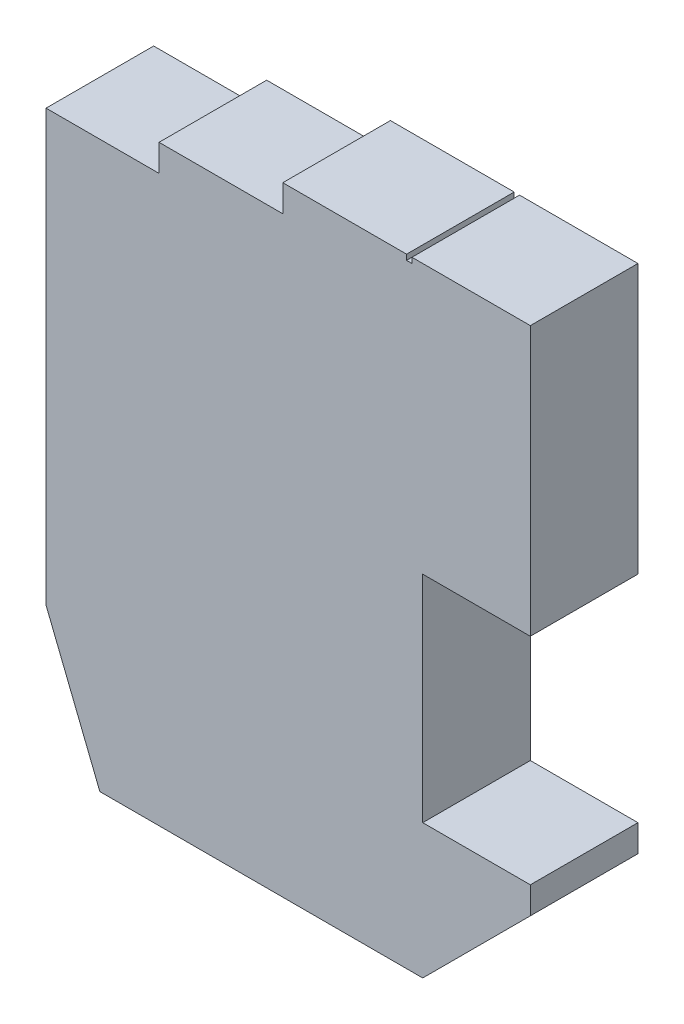
ISO-10303-21;
HEADER;
FILE_DESCRIPTION(('STEP AP214'),'2;1');
FILE_NAME('part.step','',(''),(''),'','','');
FILE_SCHEMA(('AUTOMOTIVE_DESIGN { 1 0 10303 214 1 1 1 1 }'));
ENDSEC;
DATA;
#1=APPLICATION_CONTEXT('core data for automotive mechanical design processes');
#2=APPLICATION_PROTOCOL_DEFINITION('international standard','automotive_design',2000,#1);
#3=PRODUCT_CONTEXT('',#1,'mechanical');
#4=PRODUCT('Part','Part','',(#3));
#5=PRODUCT_RELATED_PRODUCT_CATEGORY('part','',(#4));
#6=PRODUCT_DEFINITION_FORMATION('','',#4);
#7=PRODUCT_DEFINITION_CONTEXT('part definition',#1,'design');
#8=PRODUCT_DEFINITION('design','',#6,#7);
#9=PRODUCT_DEFINITION_SHAPE('','',#8);
#10=(LENGTH_UNIT() NAMED_UNIT(*) SI_UNIT(.MILLI.,.METRE.));
#11=(NAMED_UNIT(*) PLANE_ANGLE_UNIT() SI_UNIT($,.RADIAN.));
#12=(NAMED_UNIT(*) SI_UNIT($,.STERADIAN.) SOLID_ANGLE_UNIT());
#13=UNCERTAINTY_MEASURE_WITH_UNIT(LENGTH_MEASURE(1.E-05),#10,'distance_accuracy_value','');
#14=(GEOMETRIC_REPRESENTATION_CONTEXT(3) GLOBAL_UNCERTAINTY_ASSIGNED_CONTEXT((#13)) GLOBAL_UNIT_ASSIGNED_CONTEXT((#10,
#11,#12)) REPRESENTATION_CONTEXT('',''));
#15=CARTESIAN_POINT('',(0.,0.,0.));
#16=DIRECTION('',(0.,0.,1.));
#17=DIRECTION('',(1.,0.,0.));
#18=AXIS2_PLACEMENT_3D('',#15,#16,#17);
#19=CARTESIAN_POINT('',(79.9999999999999,0.,20.));
#20=DIRECTION('',(-1.,0.,0.));
#21=DIRECTION('',(0.,0.,1.));
#22=AXIS2_PLACEMENT_3D('',#19,#20,#21);
#23=PLANE('',#22);
#24=DIRECTION('',(0.,1.,0.));
#25=VECTOR('',#24,1.);
#26=CARTESIAN_POINT('',(79.9999999999999,0.,0.));
#27=LINE('',#26,#25);
#28=CARTESIAN_POINT('',(79.9999999999999,20.,0.));
#29=VERTEX_POINT('',#28);
#30=CARTESIAN_POINT('',(79.9999999999999,25.,0.));
#31=VERTEX_POINT('',#30);
#32=EDGE_CURVE('E210',#29,#31,#27,.T.);
#33=ORIENTED_EDGE('',*,*,#32,.T.);
#34=DIRECTION('',(0.,0.,1.));
#35=VECTOR('',#34,1.);
#36=CARTESIAN_POINT('',(79.9999999999999,25.,0.));
#37=LINE('',#36,#35);
#38=CARTESIAN_POINT('',(79.9999999999999,25.,20.));
#39=VERTEX_POINT('',#38);
#40=EDGE_CURVE('E175',#31,#39,#37,.T.);
#41=ORIENTED_EDGE('',*,*,#40,.T.);
#42=DIRECTION('',(0.,1.,0.));
#43=VECTOR('',#42,1.);
#44=CARTESIAN_POINT('',(79.9999999999999,0.,20.));
#45=LINE('',#44,#43);
#46=CARTESIAN_POINT('',(79.9999999999999,20.,20.));
#47=VERTEX_POINT('',#46);
#48=EDGE_CURVE('E154',#47,#39,#45,.T.);
#49=ORIENTED_EDGE('',*,*,#48,.F.);
#50=DIRECTION('',(0.,0.,-1.));
#51=VECTOR('',#50,1.);
#52=CARTESIAN_POINT('',(79.9999999999999,20.,20.));
#53=LINE('',#52,#51);
#54=EDGE_CURVE('E163',#47,#29,#53,.T.);
#55=ORIENTED_EDGE('',*,*,#54,.T.);
#56=EDGE_LOOP('',(#33,#41,#49,#55));
#57=FACE_BOUND('',#56,.T.);
#58=ADVANCED_FACE('F35',(#57),#23,.F.);
#59=CARTESIAN_POINT('',(57.9999999999999,0.,20.));
#60=DIRECTION('',(-1.,0.,0.));
#61=DIRECTION('',(0.,0.,1.));
#62=AXIS2_PLACEMENT_3D('',#59,#60,#61);
#63=PLANE('',#62);
#64=DIRECTION('',(0.,1.,0.));
#65=VECTOR('',#64,1.);
#66=CARTESIAN_POINT('',(57.9999999999999,0.,0.));
#67=LINE('',#66,#65);
#68=CARTESIAN_POINT('',(57.9999999999999,114.,0.));
#69=VERTEX_POINT('',#68);
#70=CARTESIAN_POINT('',(57.9999999999999,115.,0.));
#71=VERTEX_POINT('',#70);
#72=EDGE_CURVE('E180',#69,#71,#67,.T.);
#73=ORIENTED_EDGE('',*,*,#72,.F.);
#74=DIRECTION('',(0.,0.,-1.));
#75=VECTOR('',#74,1.);
#76=CARTESIAN_POINT('',(57.9999999999999,114.,20.));
#77=LINE('',#76,#75);
#78=CARTESIAN_POINT('',(57.9999999999999,114.,20.));
#79=VERTEX_POINT('',#78);
#80=EDGE_CURVE('E11',#79,#69,#77,.T.);
#81=ORIENTED_EDGE('',*,*,#80,.F.);
#82=DIRECTION('',(0.,1.,0.));
#83=VECTOR('',#82,1.);
#84=CARTESIAN_POINT('',(57.9999999999999,0.,20.));
#85=LINE('',#84,#83);
#86=CARTESIAN_POINT('',(57.9999999999999,115.,20.));
#87=VERTEX_POINT('',#86);
#88=EDGE_CURVE('E214',#79,#87,#85,.T.);
#89=ORIENTED_EDGE('',*,*,#88,.T.);
#90=DIRECTION('',(0.,0.,-1.));
#91=VECTOR('',#90,1.);
#92=CARTESIAN_POINT('',(57.9999999999999,115.,20.));
#93=LINE('',#92,#91);
#94=EDGE_CURVE('E109',#87,#71,#93,.T.);
#95=ORIENTED_EDGE('',*,*,#94,.T.);
#96=EDGE_LOOP('',(#73,#81,#89,#95));
#97=FACE_BOUND('',#96,.T.);
#98=ADVANCED_FACE('F37',(#97),#63,.T.);
#99=CARTESIAN_POINT('',(0.,114.,20.));
#100=DIRECTION('',(0.,1.,0.));
#101=DIRECTION('',(0.,0.,1.));
#102=AXIS2_PLACEMENT_3D('',#99,#100,#101);
#103=PLANE('',#102);
#104=DIRECTION('',(1.,0.,0.));
#105=VECTOR('',#104,1.);
#106=CARTESIAN_POINT('',(0.,114.,0.));
#107=LINE('',#106,#105);
#108=CARTESIAN_POINT('',(56.9999999999999,114.,0.));
#109=VERTEX_POINT('',#108);
#110=EDGE_CURVE('E183',#109,#69,#107,.T.);
#111=ORIENTED_EDGE('',*,*,#110,.F.);
#112=DIRECTION('',(0.,0.,-1.));
#113=VECTOR('',#112,1.);
#114=CARTESIAN_POINT('',(56.9999999999999,114.,20.));
#115=LINE('',#114,#113);
#116=CARTESIAN_POINT('',(56.9999999999999,114.,20.));
#117=VERTEX_POINT('',#116);
#118=EDGE_CURVE('E43',#117,#109,#115,.T.);
#119=ORIENTED_EDGE('',*,*,#118,.F.);
#120=DIRECTION('',(1.,0.,0.));
#121=VECTOR('',#120,1.);
#122=CARTESIAN_POINT('',(0.,114.,20.));
#123=LINE('',#122,#121);
#124=EDGE_CURVE('E260',#117,#79,#123,.T.);
#125=ORIENTED_EDGE('',*,*,#124,.T.);
#126=ORIENTED_EDGE('',*,*,#80,.T.);
#127=EDGE_LOOP('',(#111,#119,#125,#126));
#128=FACE_BOUND('',#127,.T.);
#129=ADVANCED_FACE('F248',(#128),#103,.T.);
#130=CARTESIAN_POINT('',(56.9999999999999,0.,20.));
#131=DIRECTION('',(1.,0.,0.));
#132=DIRECTION('',(0.,0.,-1.));
#133=AXIS2_PLACEMENT_3D('',#130,#131,#132);
#134=PLANE('',#133);
#135=DIRECTION('',(0.,-1.,0.));
#136=VECTOR('',#135,1.);
#137=CARTESIAN_POINT('',(56.9999999999999,0.,0.));
#138=LINE('',#137,#136);
#139=CARTESIAN_POINT('',(56.9999999999999,115.,0.));
#140=VERTEX_POINT('',#139);
#141=EDGE_CURVE('E186',#140,#109,#138,.T.);
#142=ORIENTED_EDGE('',*,*,#141,.F.);
#143=DIRECTION('',(0.,0.,-1.));
#144=VECTOR('',#143,1.);
#145=CARTESIAN_POINT('',(56.9999999999999,115.,20.));
#146=LINE('',#145,#144);
#147=CARTESIAN_POINT('',(56.9999999999999,115.,20.));
#148=VERTEX_POINT('',#147);
#149=EDGE_CURVE('E237',#148,#140,#146,.T.);
#150=ORIENTED_EDGE('',*,*,#149,.F.);
#151=DIRECTION('',(0.,-1.,0.));
#152=VECTOR('',#151,1.);
#153=CARTESIAN_POINT('',(56.9999999999999,0.,20.));
#154=LINE('',#153,#152);
#155=EDGE_CURVE('E244',#148,#117,#154,.T.);
#156=ORIENTED_EDGE('',*,*,#155,.T.);
#157=ORIENTED_EDGE('',*,*,#118,.T.);
#158=EDGE_LOOP('',(#142,#150,#156,#157));
#159=FACE_BOUND('',#158,.T.);
#160=ADVANCED_FACE('F242',(#159),#134,.T.);
#161=CARTESIAN_POINT('',(0.,115.,20.));
#162=DIRECTION('',(0.,1.,0.));
#163=DIRECTION('',(-1.,0.,0.));
#164=AXIS2_PLACEMENT_3D('',#161,#162,#163);
#165=PLANE('',#164);
#166=DIRECTION('',(1.,0.,0.));
#167=VECTOR('',#166,1.);
#168=CARTESIAN_POINT('',(0.,115.,0.));
#169=LINE('',#168,#167);
#170=CARTESIAN_POINT('',(33.9999999999999,115.,0.));
#171=VERTEX_POINT('',#170);
#172=EDGE_CURVE('E189',#171,#140,#169,.T.);
#173=ORIENTED_EDGE('',*,*,#172,.F.);
#174=DIRECTION('',(0.,0.,-1.));
#175=VECTOR('',#174,1.);
#176=CARTESIAN_POINT('',(33.9999999999999,115.,20.));
#177=LINE('',#176,#175);
#178=CARTESIAN_POINT('',(33.9999999999999,115.,20.));
#179=VERTEX_POINT('',#178);
#180=EDGE_CURVE('E235',#179,#171,#177,.T.);
#181=ORIENTED_EDGE('',*,*,#180,.F.);
#182=DIRECTION('',(1.,0.,0.));
#183=VECTOR('',#182,1.);
#184=CARTESIAN_POINT('',(0.,115.,20.));
#185=LINE('',#184,#183);
#186=EDGE_CURVE('E259',#179,#148,#185,.T.);
#187=ORIENTED_EDGE('',*,*,#186,.T.);
#188=ORIENTED_EDGE('',*,*,#149,.T.);
#189=EDGE_LOOP('',(#173,#181,#187,#188));
#190=FACE_BOUND('',#189,.T.);
#191=ADVANCED_FACE('F255',(#190),#165,.T.);
#192=CARTESIAN_POINT('',(33.9999999999999,0.,20.));
#193=DIRECTION('',(1.,0.,0.));
#194=DIRECTION('',(0.,0.,-1.));
#195=AXIS2_PLACEMENT_3D('',#192,#193,#194);
#196=PLANE('',#195);
#197=DIRECTION('',(0.,-1.,0.));
#198=VECTOR('',#197,1.);
#199=CARTESIAN_POINT('',(33.9999999999999,0.,0.));
#200=LINE('',#199,#198);
#201=CARTESIAN_POINT('',(33.9999999999999,110.,0.));
#202=VERTEX_POINT('',#201);
#203=EDGE_CURVE('E192',#171,#202,#200,.T.);
#204=ORIENTED_EDGE('',*,*,#203,.T.);
#205=DIRECTION('',(0.,0.,-1.));
#206=VECTOR('',#205,1.);
#207=CARTESIAN_POINT('',(33.9999999999999,110.,20.));
#208=LINE('',#207,#206);
#209=CARTESIAN_POINT('',(33.9999999999999,110.,20.));
#210=VERTEX_POINT('',#209);
#211=EDGE_CURVE('E232',#210,#202,#208,.T.);
#212=ORIENTED_EDGE('',*,*,#211,.F.);
#213=DIRECTION('',(0.,-1.,0.));
#214=VECTOR('',#213,1.);
#215=CARTESIAN_POINT('',(33.9999999999999,0.,20.));
#216=LINE('',#215,#214);
#217=EDGE_CURVE('E262',#179,#210,#216,.T.);
#218=ORIENTED_EDGE('',*,*,#217,.F.);
#219=ORIENTED_EDGE('',*,*,#180,.T.);
#220=EDGE_LOOP('',(#204,#212,#218,#219));
#221=FACE_BOUND('',#220,.T.);
#222=ADVANCED_FACE('F384',(#221),#196,.F.);
#223=CARTESIAN_POINT('',(0.,110.,20.));
#224=DIRECTION('',(0.,-1.,0.));
#225=DIRECTION('',(0.,0.,-1.));
#226=AXIS2_PLACEMENT_3D('',#223,#224,#225);
#227=PLANE('',#226);
#228=DIRECTION('',(-1.,0.,0.));
#229=VECTOR('',#228,1.);
#230=CARTESIAN_POINT('',(0.,110.,0.));
#231=LINE('',#230,#229);
#232=CARTESIAN_POINT('',(10.9999999999999,110.,0.));
#233=VERTEX_POINT('',#232);
#234=EDGE_CURVE('E194',#202,#233,#231,.T.);
#235=ORIENTED_EDGE('',*,*,#234,.T.);
#236=DIRECTION('',(0.,0.,-1.));
#237=VECTOR('',#236,1.);
#238=CARTESIAN_POINT('',(10.9999999999999,110.,20.));
#239=LINE('',#238,#237);
#240=CARTESIAN_POINT('',(10.9999999999999,110.,20.));
#241=VERTEX_POINT('',#240);
#242=EDGE_CURVE('E229',#241,#233,#239,.T.);
#243=ORIENTED_EDGE('',*,*,#242,.F.);
#244=DIRECTION('',(-1.,0.,0.));
#245=VECTOR('',#244,1.);
#246=CARTESIAN_POINT('',(0.,110.,20.));
#247=LINE('',#246,#245);
#248=EDGE_CURVE('E268',#210,#241,#247,.T.);
#249=ORIENTED_EDGE('',*,*,#248,.F.);
#250=ORIENTED_EDGE('',*,*,#211,.T.);
#251=EDGE_LOOP('',(#235,#243,#249,#250));
#252=FACE_BOUND('',#251,.T.);
#253=ADVANCED_FACE('F380',(#252),#227,.F.);
#254=CARTESIAN_POINT('',(11.,0.,20.));
#255=DIRECTION('',(1.,0.,0.));
#256=DIRECTION('',(0.,1.,0.));
#257=AXIS2_PLACEMENT_3D('',#254,#255,#256);
#258=PLANE('',#257);
#259=DIRECTION('',(0.,-1.,0.));
#260=VECTOR('',#259,1.);
#261=CARTESIAN_POINT('',(11.,0.,0.));
#262=LINE('',#261,#260);
#263=CARTESIAN_POINT('',(10.9999999999999,105.,0.));
#264=VERTEX_POINT('',#263);
#265=EDGE_CURVE('E196',#233,#264,#262,.T.);
#266=ORIENTED_EDGE('',*,*,#265,.T.);
#267=DIRECTION('',(0.,0.,-1.));
#268=VECTOR('',#267,1.);
#269=CARTESIAN_POINT('',(10.9999999999999,105.,20.));
#270=LINE('',#269,#268);
#271=CARTESIAN_POINT('',(10.9999999999999,105.,20.));
#272=VERTEX_POINT('',#271);
#273=EDGE_CURVE('E227',#272,#264,#270,.T.);
#274=ORIENTED_EDGE('',*,*,#273,.F.);
#275=DIRECTION('',(0.,-1.,0.));
#276=VECTOR('',#275,1.);
#277=CARTESIAN_POINT('',(11.,0.,20.));
#278=LINE('',#277,#276);
#279=EDGE_CURVE('E270',#241,#272,#278,.T.);
#280=ORIENTED_EDGE('',*,*,#279,.F.);
#281=ORIENTED_EDGE('',*,*,#242,.T.);
#282=EDGE_LOOP('',(#266,#274,#280,#281));
#283=FACE_BOUND('',#282,.T.);
#284=ADVANCED_FACE('F376',(#283),#258,.F.);
#285=CARTESIAN_POINT('',(0.,105.,20.));
#286=DIRECTION('',(0.,1.,0.));
#287=DIRECTION('',(0.,0.,1.));
#288=AXIS2_PLACEMENT_3D('',#285,#286,#287);
#289=PLANE('',#288);
#290=DIRECTION('',(1.,0.,0.));
#291=VECTOR('',#290,1.);
#292=CARTESIAN_POINT('',(0.,105.,0.));
#293=LINE('',#292,#291);
#294=CARTESIAN_POINT('',(-10.0000000000001,105.,0.));
#295=VERTEX_POINT('',#294);
#296=EDGE_CURVE('E199',#295,#264,#293,.T.);
#297=ORIENTED_EDGE('',*,*,#296,.F.);
#298=DIRECTION('',(0.,0.,-1.));
#299=VECTOR('',#298,1.);
#300=CARTESIAN_POINT('',(-10.0000000000001,105.,20.));
#301=LINE('',#300,#299);
#302=CARTESIAN_POINT('',(-10.0000000000001,105.,20.));
#303=VERTEX_POINT('',#302);
#304=EDGE_CURVE('E225',#303,#295,#301,.T.);
#305=ORIENTED_EDGE('',*,*,#304,.F.);
#306=DIRECTION('',(1.,0.,0.));
#307=VECTOR('',#306,1.);
#308=CARTESIAN_POINT('',(0.,105.,20.));
#309=LINE('',#308,#307);
#310=EDGE_CURVE('E272',#303,#272,#309,.T.);
#311=ORIENTED_EDGE('',*,*,#310,.T.);
#312=ORIENTED_EDGE('',*,*,#273,.T.);
#313=EDGE_LOOP('',(#297,#305,#311,#312));
#314=FACE_BOUND('',#313,.T.);
#315=ADVANCED_FACE('F372',(#314),#289,.T.);
#316=CARTESIAN_POINT('',(-10.0000000000001,0.,20.));
#317=DIRECTION('',(1.,0.,0.));
#318=DIRECTION('',(0.,1.,0.));
#319=AXIS2_PLACEMENT_3D('',#316,#317,#318);
#320=PLANE('',#319);
#321=DIRECTION('',(0.,-1.,0.));
#322=VECTOR('',#321,1.);
#323=CARTESIAN_POINT('',(-10.0000000000001,0.,0.));
#324=LINE('',#323,#322);
#325=CARTESIAN_POINT('',(-10.0000000000001,25.,0.));
#326=VERTEX_POINT('',#325);
#327=EDGE_CURVE('E202',#295,#326,#324,.T.);
#328=ORIENTED_EDGE('',*,*,#327,.T.);
#329=DIRECTION('',(0.,0.,-1.));
#330=VECTOR('',#329,1.);
#331=CARTESIAN_POINT('',(-10.0000000000001,25.,20.));
#332=LINE('',#331,#330);
#333=CARTESIAN_POINT('',(-10.0000000000001,25.,20.));
#334=VERTEX_POINT('',#333);
#335=EDGE_CURVE('E222',#334,#326,#332,.T.);
#336=ORIENTED_EDGE('',*,*,#335,.F.);
#337=DIRECTION('',(0.,-1.,0.));
#338=VECTOR('',#337,1.);
#339=CARTESIAN_POINT('',(-10.0000000000001,0.,20.));
#340=LINE('',#339,#338);
#341=EDGE_CURVE('E275',#303,#334,#340,.T.);
#342=ORIENTED_EDGE('',*,*,#341,.F.);
#343=ORIENTED_EDGE('',*,*,#304,.T.);
#344=EDGE_LOOP('',(#328,#336,#342,#343));
#345=FACE_BOUND('',#344,.T.);
#346=ADVANCED_FACE('F369',(#345),#320,.F.);
#347=CARTESIAN_POINT('',(0.,0.,20.));
#348=DIRECTION('',(0.928476690885259,0.371390676354106,0.));
#349=DIRECTION('',(-0.371390676354106,0.928476690885259,0.));
#350=AXIS2_PLACEMENT_3D('',#347,#348,#349);
#351=PLANE('',#350);
#352=DIRECTION('',(0.371390676354106,-0.928476690885259,0.));
#353=VECTOR('',#352,1.);
#354=CARTESIAN_POINT('',(0.,0.,0.));
#355=LINE('',#354,#353);
#356=CARTESIAN_POINT('',(0.,0.,0.));
#357=VERTEX_POINT('',#356);
#358=EDGE_CURVE('E204',#326,#357,#355,.T.);
#359=ORIENTED_EDGE('',*,*,#358,.T.);
#360=DIRECTION('',(0.,0.,-1.));
#361=VECTOR('',#360,1.);
#362=CARTESIAN_POINT('',(0.,0.,20.));
#363=LINE('',#362,#361);
#364=CARTESIAN_POINT('',(0.,0.,20.));
#365=VERTEX_POINT('',#364);
#366=EDGE_CURVE('E219',#365,#357,#363,.T.);
#367=ORIENTED_EDGE('',*,*,#366,.F.);
#368=DIRECTION('',(0.371390676354106,-0.928476690885259,0.));
#369=VECTOR('',#368,1.);
#370=CARTESIAN_POINT('',(0.,0.,20.));
#371=LINE('',#370,#369);
#372=EDGE_CURVE('E277',#334,#365,#371,.T.);
#373=ORIENTED_EDGE('',*,*,#372,.F.);
#374=ORIENTED_EDGE('',*,*,#335,.T.);
#375=EDGE_LOOP('',(#359,#367,#373,#374));
#376=FACE_BOUND('',#375,.T.);
#377=ADVANCED_FACE('F284',(#376),#351,.F.);
#378=CARTESIAN_POINT('',(0.,0.,20.));
#379=DIRECTION('',(0.,1.,0.));
#380=DIRECTION('',(0.,0.,1.));
#381=AXIS2_PLACEMENT_3D('',#378,#379,#380);
#382=PLANE('',#381);
#383=DIRECTION('',(1.,0.,0.));
#384=VECTOR('',#383,1.);
#385=CARTESIAN_POINT('',(0.,0.,0.));
#386=LINE('',#385,#384);
#387=CARTESIAN_POINT('',(60.,0.,0.));
#388=VERTEX_POINT('',#387);
#389=EDGE_CURVE('E206',#357,#388,#386,.T.);
#390=ORIENTED_EDGE('',*,*,#389,.T.);
#391=DIRECTION('',(0.,0.,-1.));
#392=VECTOR('',#391,1.);
#393=CARTESIAN_POINT('',(60.,0.,20.));
#394=LINE('',#393,#392);
#395=CARTESIAN_POINT('',(60.,0.,20.));
#396=VERTEX_POINT('',#395);
#397=EDGE_CURVE('E170',#396,#388,#394,.T.);
#398=ORIENTED_EDGE('',*,*,#397,.F.);
#399=DIRECTION('',(1.,0.,0.));
#400=VECTOR('',#399,1.);
#401=CARTESIAN_POINT('',(0.,0.,20.));
#402=LINE('',#401,#400);
#403=EDGE_CURVE('E156',#365,#396,#402,.T.);
#404=ORIENTED_EDGE('',*,*,#403,.F.);
#405=ORIENTED_EDGE('',*,*,#366,.T.);
#406=EDGE_LOOP('',(#390,#398,#404,#405));
#407=FACE_BOUND('',#406,.T.);
#408=ADVANCED_FACE('F288',(#407),#382,.F.);
#409=CARTESIAN_POINT('',(30.0000000000001,-30.,20.));
#410=DIRECTION('',(-0.707106781186549,0.707106781186546,0.));
#411=DIRECTION('',(-0.707106781186546,-0.707106781186549,0.));
#412=AXIS2_PLACEMENT_3D('',#409,#410,#411);
#413=PLANE('',#412);
#414=DIRECTION('',(0.707106781186546,0.707106781186549,0.));
#415=VECTOR('',#414,1.);
#416=CARTESIAN_POINT('',(30.0000000000001,-30.,0.));
#417=LINE('',#416,#415);
#418=EDGE_CURVE('E166',#388,#29,#417,.T.);
#419=ORIENTED_EDGE('',*,*,#418,.T.);
#420=ORIENTED_EDGE('',*,*,#54,.F.);
#421=DIRECTION('',(0.707106781186546,0.707106781186549,0.));
#422=VECTOR('',#421,1.);
#423=CARTESIAN_POINT('',(30.0000000000001,-30.,20.));
#424=LINE('',#423,#422);
#425=EDGE_CURVE('E149',#396,#47,#424,.T.);
#426=ORIENTED_EDGE('',*,*,#425,.F.);
#427=ORIENTED_EDGE('',*,*,#397,.T.);
#428=EDGE_LOOP('',(#419,#420,#426,#427));
#429=FACE_BOUND('',#428,.T.);
#430=ADVANCED_FACE('F164',(#429),#413,.F.);
#431=CARTESIAN_POINT('',(79.9999999999999,65.,20.));
#432=VERTEX_POINT('',#431);
#433=CARTESIAN_POINT('',(79.9999999999999,115.,20.));
#434=VERTEX_POINT('',#433);
#435=EDGE_CURVE('E160',#432,#434,#45,.T.);
#436=ORIENTED_EDGE('',*,*,#435,.F.);
#437=DIRECTION('',(0.,0.,1.));
#438=VECTOR('',#437,1.);
#439=CARTESIAN_POINT('',(79.9999999999999,65.,0.));
#440=LINE('',#439,#438);
#441=CARTESIAN_POINT('',(79.9999999999999,65.,0.));
#442=VERTEX_POINT('',#441);
#443=EDGE_CURVE('E316',#442,#432,#440,.T.);
#444=ORIENTED_EDGE('',*,*,#443,.F.);
#445=CARTESIAN_POINT('',(79.9999999999999,115.,0.));
#446=VERTEX_POINT('',#445);
#447=EDGE_CURVE('E209',#442,#446,#27,.T.);
#448=ORIENTED_EDGE('',*,*,#447,.T.);
#449=DIRECTION('',(0.,0.,-1.));
#450=VECTOR('',#449,1.);
#451=CARTESIAN_POINT('',(79.9999999999999,115.,20.));
#452=LINE('',#451,#450);
#453=EDGE_CURVE('E171',#434,#446,#452,.T.);
#454=ORIENTED_EDGE('',*,*,#453,.F.);
#455=EDGE_LOOP('',(#436,#444,#448,#454));
#456=FACE_BOUND('',#455,.T.);
#457=ADVANCED_FACE('F323',(#456),#23,.F.);
#458=CARTESIAN_POINT('',(0.,115.,20.));
#459=DIRECTION('',(0.,-1.,0.));
#460=DIRECTION('',(0.,0.,-1.));
#461=AXIS2_PLACEMENT_3D('',#458,#459,#460);
#462=PLANE('',#461);
#463=DIRECTION('',(-1.,0.,0.));
#464=VECTOR('',#463,1.);
#465=CARTESIAN_POINT('',(0.,115.,0.));
#466=LINE('',#465,#464);
#467=EDGE_CURVE('E212',#446,#71,#466,.T.);
#468=ORIENTED_EDGE('',*,*,#467,.T.);
#469=ORIENTED_EDGE('',*,*,#94,.F.);
#470=DIRECTION('',(-1.,0.,0.));
#471=VECTOR('',#470,1.);
#472=CARTESIAN_POINT('',(0.,115.,20.));
#473=LINE('',#472,#471);
#474=EDGE_CURVE('E59',#434,#87,#473,.T.);
#475=ORIENTED_EDGE('',*,*,#474,.F.);
#476=ORIENTED_EDGE('',*,*,#453,.T.);
#477=EDGE_LOOP('',(#468,#469,#475,#476));
#478=FACE_BOUND('',#477,.T.);
#479=ADVANCED_FACE('F328',(#478),#462,.F.);
#480=CARTESIAN_POINT('',(0.,0.,20.));
#481=DIRECTION('',(0.,0.,1.));
#482=DIRECTION('',(1.,0.,0.));
#483=AXIS2_PLACEMENT_3D('',#480,#481,#482);
#484=PLANE('',#483);
#485=DIRECTION('',(1.,0.,0.));
#486=VECTOR('',#485,1.);
#487=CARTESIAN_POINT('',(79.9999999999999,25.,20.));
#488=LINE('',#487,#486);
#489=CARTESIAN_POINT('',(59.9999999999999,25.,20.));
#490=VERTEX_POINT('',#489);
#491=EDGE_CURVE('E308',#490,#39,#488,.T.);
#492=ORIENTED_EDGE('',*,*,#491,.F.);
#493=DIRECTION('',(0.,-1.,0.));
#494=VECTOR('',#493,1.);
#495=CARTESIAN_POINT('',(59.9999999999999,25.,20.));
#496=LINE('',#495,#494);
#497=CARTESIAN_POINT('',(59.9999999999999,65.,20.));
#498=VERTEX_POINT('',#497);
#499=EDGE_CURVE('E334',#498,#490,#496,.T.);
#500=ORIENTED_EDGE('',*,*,#499,.F.);
#501=DIRECTION('',(-1.,0.,0.));
#502=VECTOR('',#501,1.);
#503=CARTESIAN_POINT('',(59.9999999999999,65.,20.));
#504=LINE('',#503,#502);
#505=EDGE_CURVE('E336',#432,#498,#504,.T.);
#506=ORIENTED_EDGE('',*,*,#505,.F.);
#507=ORIENTED_EDGE('',*,*,#435,.T.);
#508=ORIENTED_EDGE('',*,*,#474,.T.);
#509=ORIENTED_EDGE('',*,*,#88,.F.);
#510=ORIENTED_EDGE('',*,*,#124,.F.);
#511=ORIENTED_EDGE('',*,*,#155,.F.);
#512=ORIENTED_EDGE('',*,*,#186,.F.);
#513=ORIENTED_EDGE('',*,*,#217,.T.);
#514=ORIENTED_EDGE('',*,*,#248,.T.);
#515=ORIENTED_EDGE('',*,*,#279,.T.);
#516=ORIENTED_EDGE('',*,*,#310,.F.);
#517=ORIENTED_EDGE('',*,*,#341,.T.);
#518=ORIENTED_EDGE('',*,*,#372,.T.);
#519=ORIENTED_EDGE('',*,*,#403,.T.);
#520=ORIENTED_EDGE('',*,*,#425,.T.);
#521=ORIENTED_EDGE('',*,*,#48,.T.);
#522=EDGE_LOOP('',(#492,#500,#506,#507,#508,#509,#510,#511,#512,#513,#514,#515,#516,#517,#518,
#519,#520,#521));
#523=FACE_BOUND('',#522,.T.);
#524=ADVANCED_FACE('F152',(#523),#484,.T.);
#525=CARTESIAN_POINT('',(0.,0.,0.));
#526=DIRECTION('',(0.,0.,1.));
#527=DIRECTION('',(1.,0.,0.));
#528=AXIS2_PLACEMENT_3D('',#525,#526,#527);
#529=PLANE('',#528);
#530=DIRECTION('',(0.,-1.,0.));
#531=VECTOR('',#530,1.);
#532=CARTESIAN_POINT('',(59.9999999999999,25.,0.));
#533=LINE('',#532,#531);
#534=CARTESIAN_POINT('',(59.9999999999999,65.,0.));
#535=VERTEX_POINT('',#534);
#536=CARTESIAN_POINT('',(59.9999999999999,25.,0.));
#537=VERTEX_POINT('',#536);
#538=EDGE_CURVE('E50',#535,#537,#533,.T.);
#539=ORIENTED_EDGE('',*,*,#538,.T.);
#540=DIRECTION('',(1.,0.,0.));
#541=VECTOR('',#540,1.);
#542=CARTESIAN_POINT('',(79.9999999999999,25.,0.));
#543=LINE('',#542,#541);
#544=EDGE_CURVE('E291',#537,#31,#543,.T.);
#545=ORIENTED_EDGE('',*,*,#544,.T.);
#546=ORIENTED_EDGE('',*,*,#32,.F.);
#547=ORIENTED_EDGE('',*,*,#418,.F.);
#548=ORIENTED_EDGE('',*,*,#389,.F.);
#549=ORIENTED_EDGE('',*,*,#358,.F.);
#550=ORIENTED_EDGE('',*,*,#327,.F.);
#551=ORIENTED_EDGE('',*,*,#296,.T.);
#552=ORIENTED_EDGE('',*,*,#265,.F.);
#553=ORIENTED_EDGE('',*,*,#234,.F.);
#554=ORIENTED_EDGE('',*,*,#203,.F.);
#555=ORIENTED_EDGE('',*,*,#172,.T.);
#556=ORIENTED_EDGE('',*,*,#141,.T.);
#557=ORIENTED_EDGE('',*,*,#110,.T.);
#558=ORIENTED_EDGE('',*,*,#72,.T.);
#559=ORIENTED_EDGE('',*,*,#467,.F.);
#560=ORIENTED_EDGE('',*,*,#447,.F.);
#561=DIRECTION('',(-1.,0.,0.));
#562=VECTOR('',#561,1.);
#563=CARTESIAN_POINT('',(59.9999999999999,65.,0.));
#564=LINE('',#563,#562);
#565=EDGE_CURVE('E312',#442,#535,#564,.T.);
#566=ORIENTED_EDGE('',*,*,#565,.T.);
#567=EDGE_LOOP('',(#539,#545,#546,#547,#548,#549,#550,#551,#552,#553,#554,#555,#556,#557,#558,
#559,#560,#566));
#568=FACE_BOUND('',#567,.T.);
#569=ADVANCED_FACE('F250',(#568),#529,.F.);
#570=CARTESIAN_POINT('',(79.9999999999999,25.,0.));
#571=DIRECTION('',(0.,-1.,0.));
#572=DIRECTION('',(1.,0.,0.));
#573=AXIS2_PLACEMENT_3D('',#570,#571,#572);
#574=PLANE('',#573);
#575=ORIENTED_EDGE('',*,*,#491,.T.);
#576=ORIENTED_EDGE('',*,*,#40,.F.);
#577=ORIENTED_EDGE('',*,*,#544,.F.);
#578=DIRECTION('',(0.,0.,1.));
#579=VECTOR('',#578,1.);
#580=CARTESIAN_POINT('',(59.9999999999999,25.,0.));
#581=LINE('',#580,#579);
#582=EDGE_CURVE('E306',#537,#490,#581,.T.);
#583=ORIENTED_EDGE('',*,*,#582,.T.);
#584=EDGE_LOOP('',(#575,#576,#577,#583));
#585=FACE_BOUND('',#584,.T.);
#586=ADVANCED_FACE('F341',(#585),#574,.F.);
#587=CARTESIAN_POINT('',(59.9999999999999,25.,0.));
#588=DIRECTION('',(-1.,0.,0.));
#589=DIRECTION('',(0.,-1.,0.));
#590=AXIS2_PLACEMENT_3D('',#587,#588,#589);
#591=PLANE('',#590);
#592=ORIENTED_EDGE('',*,*,#499,.T.);
#593=ORIENTED_EDGE('',*,*,#582,.F.);
#594=ORIENTED_EDGE('',*,*,#538,.F.);
#595=DIRECTION('',(0.,0.,1.));
#596=VECTOR('',#595,1.);
#597=CARTESIAN_POINT('',(59.9999999999999,65.,0.));
#598=LINE('',#597,#596);
#599=EDGE_CURVE('E318',#535,#498,#598,.T.);
#600=ORIENTED_EDGE('',*,*,#599,.T.);
#601=EDGE_LOOP('',(#592,#593,#594,#600));
#602=FACE_BOUND('',#601,.T.);
#603=ADVANCED_FACE('F340',(#602),#591,.F.);
#604=CARTESIAN_POINT('',(59.9999999999999,65.,0.));
#605=DIRECTION('',(0.,1.,0.));
#606=DIRECTION('',(0.,0.,1.));
#607=AXIS2_PLACEMENT_3D('',#604,#605,#606);
#608=PLANE('',#607);
#609=ORIENTED_EDGE('',*,*,#505,.T.);
#610=ORIENTED_EDGE('',*,*,#599,.F.);
#611=ORIENTED_EDGE('',*,*,#565,.F.);
#612=ORIENTED_EDGE('',*,*,#443,.T.);
#613=EDGE_LOOP('',(#609,#610,#611,#612));
#614=FACE_BOUND('',#613,.T.);
#615=ADVANCED_FACE('F315',(#614),#608,.F.);
#616=CLOSED_SHELL('',(#58,#98,#129,#160,#191,#222,#253,#284,#315,#346,#377,#408,#430,#457,#479,
#524,#569,#586,#603,#615));
#617=MANIFOLD_SOLID_BREP('B2',#616);
#618=ADVANCED_BREP_SHAPE_REPRESENTATION('',(#18,#617),#14);
#619=SHAPE_DEFINITION_REPRESENTATION(#9,#618);
ENDSEC;
END-ISO-10303-21;
